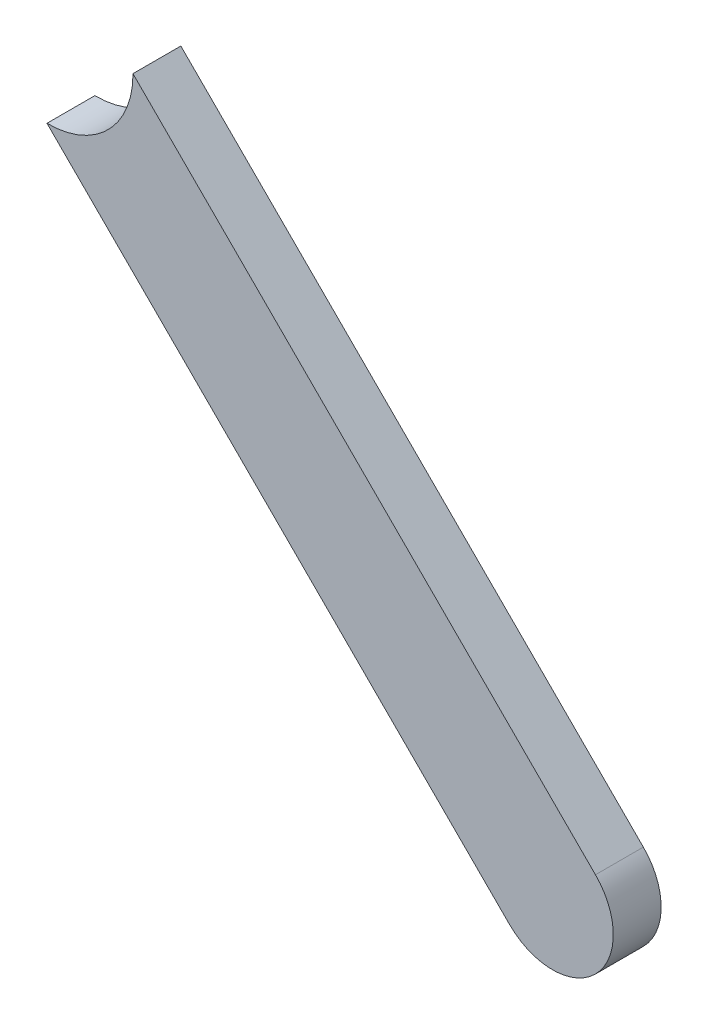
ISO-10303-21;
HEADER;
FILE_DESCRIPTION(('STEP AP214'),'2;1');
FILE_NAME('part.step','',(''),(''),'','','');
FILE_SCHEMA(('AUTOMOTIVE_DESIGN { 1 0 10303 214 1 1 1 1 }'));
ENDSEC;
DATA;
#1=APPLICATION_CONTEXT('core data for automotive mechanical design processes');
#2=APPLICATION_PROTOCOL_DEFINITION('international standard','automotive_design',2000,#1);
#3=PRODUCT_CONTEXT('',#1,'mechanical');
#4=PRODUCT('Part','Part','',(#3));
#5=PRODUCT_RELATED_PRODUCT_CATEGORY('part','',(#4));
#6=PRODUCT_DEFINITION_FORMATION('','',#4);
#7=PRODUCT_DEFINITION_CONTEXT('part definition',#1,'design');
#8=PRODUCT_DEFINITION('design','',#6,#7);
#9=PRODUCT_DEFINITION_SHAPE('','',#8);
#10=(LENGTH_UNIT() NAMED_UNIT(*) SI_UNIT(.MILLI.,.METRE.));
#11=(NAMED_UNIT(*) PLANE_ANGLE_UNIT() SI_UNIT($,.RADIAN.));
#12=(NAMED_UNIT(*) SI_UNIT($,.STERADIAN.) SOLID_ANGLE_UNIT());
#13=UNCERTAINTY_MEASURE_WITH_UNIT(LENGTH_MEASURE(1.E-05),#10,'distance_accuracy_value','');
#14=(GEOMETRIC_REPRESENTATION_CONTEXT(3) GLOBAL_UNCERTAINTY_ASSIGNED_CONTEXT((#13)) GLOBAL_UNIT_ASSIGNED_CONTEXT((#10,
#11,#12)) REPRESENTATION_CONTEXT('',''));
#15=CARTESIAN_POINT('',(0.,0.,0.));
#16=DIRECTION('',(0.,0.,1.));
#17=DIRECTION('',(1.,0.,0.));
#18=AXIS2_PLACEMENT_3D('',#15,#16,#17);
#19=CARTESIAN_POINT('',(136.140372153798,73.0504185062015,0.));
#20=DIRECTION('',(0.707106781186548,0.707106781186548,0.));
#21=DIRECTION('',(0.707106781186548,-0.707106781186548,0.));
#22=AXIS2_PLACEMENT_3D('',#19,#20,#21);
#23=PLANE('',#22);
#24=DIRECTION('',(0.707106781186548,-0.707106781186548,0.));
#25=VECTOR('',#24,1.);
#26=CARTESIAN_POINT('',(135.96439406,73.2263966,0.1999996));
#27=LINE('',#26,#25);
#28=CARTESIAN_POINT('',(136.140372153798,73.0504185062016,0.1999996));
#29=VERTEX_POINT('',#28);
#30=CARTESIAN_POINT('',(138.0725966,71.11819406,0.1999996));
#31=VERTEX_POINT('',#30);
#32=EDGE_CURVE('E11',#29,#31,#27,.T.);
#33=ORIENTED_EDGE('',*,*,#32,.F.);
#34=DIRECTION('',(0.,0.,1.));
#35=VECTOR('',#34,1.);
#36=CARTESIAN_POINT('',(136.140372153798,73.0504185062016,0.));
#37=LINE('',#36,#35);
#38=CARTESIAN_POINT('',(136.140372153798,73.0504185062016,0.));
#39=VERTEX_POINT('',#38);
#40=EDGE_CURVE('E24',#39,#29,#37,.T.);
#41=ORIENTED_EDGE('',*,*,#40,.F.);
#42=DIRECTION('',(0.707106781186548,-0.707106781186548,0.));
#43=VECTOR('',#42,1.);
#44=CARTESIAN_POINT('',(135.96439406,73.2263966,0.));
#45=LINE('',#44,#43);
#46=CARTESIAN_POINT('',(138.0725966,71.11819406,0.));
#47=VERTEX_POINT('',#46);
#48=EDGE_CURVE('E82',#39,#47,#45,.T.);
#49=ORIENTED_EDGE('',*,*,#48,.T.);
#50=DIRECTION('',(0.,0.,1.));
#51=VECTOR('',#50,1.);
#52=CARTESIAN_POINT('',(138.0725966,71.11819406,0.));
#53=LINE('',#52,#51);
#54=EDGE_CURVE('E37',#47,#31,#53,.T.);
#55=ORIENTED_EDGE('',*,*,#54,.T.);
#56=EDGE_LOOP('',(#33,#41,#49,#55));
#57=FACE_BOUND('',#56,.T.);
#58=ADVANCED_FACE('F17',(#57),#23,.F.);
#59=CARTESIAN_POINT('',(138.25220127,71.29779873,0.));
#60=DIRECTION('',(0.,0.,-1.));
#61=DIRECTION('',(-0.707106781186548,-0.707106781186548,0.));
#62=AXIS2_PLACEMENT_3D('',#59,#60,#61);
#63=CYLINDRICAL_SURFACE('',#62,0.253999360179549);
#64=CARTESIAN_POINT('',(138.25220127,71.29779873,0.1999996));
#65=DIRECTION('',(0.,0.,1.));
#66=DIRECTION('',(-0.707106781186548,-0.707106781186548,0.));
#67=AXIS2_PLACEMENT_3D('',#64,#65,#66);
#68=CIRCLE('',#67,0.253999360179549);
#69=CARTESIAN_POINT('',(138.43180594,71.4774034,0.1999996));
#70=VERTEX_POINT('',#69);
#71=EDGE_CURVE('E97',#31,#70,#68,.T.);
#72=ORIENTED_EDGE('',*,*,#71,.F.);
#73=ORIENTED_EDGE('',*,*,#54,.F.);
#74=CARTESIAN_POINT('',(138.25220127,71.29779873,0.));
#75=DIRECTION('',(0.,0.,1.));
#76=DIRECTION('',(-0.707106781186548,-0.707106781186548,0.));
#77=AXIS2_PLACEMENT_3D('',#74,#75,#76);
#78=CIRCLE('',#77,0.253999360179549);
#79=CARTESIAN_POINT('',(138.43180594,71.4774034,0.));
#80=VERTEX_POINT('',#79);
#81=EDGE_CURVE('E94',#47,#80,#78,.T.);
#82=ORIENTED_EDGE('',*,*,#81,.T.);
#83=DIRECTION('',(0.,0.,1.));
#84=VECTOR('',#83,1.);
#85=CARTESIAN_POINT('',(138.43180594,71.4774034,0.));
#86=LINE('',#85,#84);
#87=EDGE_CURVE('E92',#80,#70,#86,.T.);
#88=ORIENTED_EDGE('',*,*,#87,.T.);
#89=EDGE_LOOP('',(#72,#73,#82,#88));
#90=FACE_BOUND('',#89,.T.);
#91=ADVANCED_FACE('F103',(#90),#63,.T.);
#92=CARTESIAN_POINT('',(138.43180594,71.4774034,0.));
#93=DIRECTION('',(-0.707106781186548,-0.707106781186548,0.));
#94=DIRECTION('',(-0.707106781186548,0.707106781186548,0.));
#95=AXIS2_PLACEMENT_3D('',#92,#93,#94);
#96=PLANE('',#95);
#97=DIRECTION('',(-0.707106781186548,0.707106781186548,0.));
#98=VECTOR('',#97,1.);
#99=CARTESIAN_POINT('',(138.43180594,71.4774034,0.1999996));
#100=LINE('',#99,#98);
#101=CARTESIAN_POINT('',(136.499581493798,73.4096278462015,0.1999996));
#102=VERTEX_POINT('',#101);
#103=EDGE_CURVE('E89',#70,#102,#100,.T.);
#104=ORIENTED_EDGE('',*,*,#103,.F.);
#105=ORIENTED_EDGE('',*,*,#87,.F.);
#106=DIRECTION('',(-0.707106781186548,0.707106781186548,0.));
#107=VECTOR('',#106,1.);
#108=CARTESIAN_POINT('',(138.43180594,71.4774034,0.));
#109=LINE('',#108,#107);
#110=CARTESIAN_POINT('',(136.499581493798,73.4096278462015,0.));
#111=VERTEX_POINT('',#110);
#112=EDGE_CURVE('E87',#80,#111,#109,.T.);
#113=ORIENTED_EDGE('',*,*,#112,.T.);
#114=DIRECTION('',(0.,0.,1.));
#115=VECTOR('',#114,1.);
#116=CARTESIAN_POINT('',(136.499581493798,73.4096278462015,0.));
#117=LINE('',#116,#115);
#118=EDGE_CURVE('E69',#111,#102,#117,.T.);
#119=ORIENTED_EDGE('',*,*,#118,.T.);
#120=EDGE_LOOP('',(#104,#105,#113,#119));
#121=FACE_BOUND('',#120,.T.);
#122=ADVANCED_FACE('F108',(#121),#96,.F.);
#123=CARTESIAN_POINT('',(136.144,73.406,0.));
#124=DIRECTION('',(0.,0.,-1.));
#125=DIRECTION('',(1.,0.,0.));
#126=AXIS2_PLACEMENT_3D('',#123,#124,#125);
#127=CYLINDRICAL_SURFACE('',#126,0.3556);
#128=DIRECTION('',(0.,0.,1.));
#129=VECTOR('',#128,1.);
#130=CARTESIAN_POINT('',(136.4996,73.406,0.));
#131=LINE('',#130,#129);
#132=CARTESIAN_POINT('',(136.4996,73.406,0.));
#133=VERTEX_POINT('',#132);
#134=CARTESIAN_POINT('',(136.4996,73.406,0.1999996));
#135=VERTEX_POINT('',#134);
#136=EDGE_CURVE('E59',#133,#135,#131,.T.);
#137=ORIENTED_EDGE('',*,*,#136,.T.);
#138=CARTESIAN_POINT('',(136.144,73.406,0.1999996));
#139=DIRECTION('',(0.,0.,1.));
#140=DIRECTION('',(1.,0.,0.));
#141=AXIS2_PLACEMENT_3D('',#138,#139,#140);
#142=CIRCLE('',#141,0.3556);
#143=EDGE_CURVE('E70',#135,#102,#142,.T.);
#144=ORIENTED_EDGE('',*,*,#143,.T.);
#145=ORIENTED_EDGE('',*,*,#118,.F.);
#146=CARTESIAN_POINT('',(136.144,73.406,0.));
#147=DIRECTION('',(0.,0.,1.));
#148=DIRECTION('',(1.,0.,0.));
#149=AXIS2_PLACEMENT_3D('',#146,#147,#148);
#150=CIRCLE('',#149,0.3556);
#151=EDGE_CURVE('E73',#133,#111,#150,.T.);
#152=ORIENTED_EDGE('',*,*,#151,.F.);
#153=EDGE_LOOP('',(#137,#144,#145,#152));
#154=FACE_BOUND('',#153,.T.);
#155=ADVANCED_FACE('F74',(#154),#127,.F.);
#156=CARTESIAN_POINT('',(136.144,73.406,0.));
#157=DIRECTION('',(0.,0.,-1.));
#158=DIRECTION('',(1.,0.,0.));
#159=AXIS2_PLACEMENT_3D('',#156,#157,#158);
#160=CYLINDRICAL_SURFACE('',#159,0.3556);
#161=ORIENTED_EDGE('',*,*,#40,.T.);
#162=CARTESIAN_POINT('',(136.144,73.406,0.1999996));
#163=DIRECTION('',(0.,0.,1.));
#164=DIRECTION('',(1.,0.,0.));
#165=AXIS2_PLACEMENT_3D('',#162,#163,#164);
#166=CIRCLE('',#165,0.3556);
#167=EDGE_CURVE('E65',#29,#135,#166,.T.);
#168=ORIENTED_EDGE('',*,*,#167,.T.);
#169=ORIENTED_EDGE('',*,*,#136,.F.);
#170=EDGE_CURVE('E63',#39,#133,#150,.T.);
#171=ORIENTED_EDGE('',*,*,#170,.F.);
#172=EDGE_LOOP('',(#161,#168,#169,#171));
#173=FACE_BOUND('',#172,.T.);
#174=ADVANCED_FACE('F61',(#173),#160,.F.);
#175=CARTESIAN_POINT('',(135.96439406,73.2263966,0.));
#176=DIRECTION('',(0.,0.,-1.));
#177=DIRECTION('',(-1.,0.,0.));
#178=AXIS2_PLACEMENT_3D('',#175,#176,#177);
#179=PLANE('',#178);
#180=ORIENTED_EDGE('',*,*,#48,.F.);
#181=ORIENTED_EDGE('',*,*,#170,.T.);
#182=ORIENTED_EDGE('',*,*,#151,.T.);
#183=ORIENTED_EDGE('',*,*,#112,.F.);
#184=ORIENTED_EDGE('',*,*,#81,.F.);
#185=EDGE_LOOP('',(#180,#181,#182,#183,#184));
#186=FACE_BOUND('',#185,.T.);
#187=ADVANCED_FACE('F80',(#186),#179,.T.);
#188=CARTESIAN_POINT('',(135.96439406,73.2263966,0.1999996));
#189=DIRECTION('',(0.,0.,-1.));
#190=DIRECTION('',(-1.,0.,0.));
#191=AXIS2_PLACEMENT_3D('',#188,#189,#190);
#192=PLANE('',#191);
#193=ORIENTED_EDGE('',*,*,#167,.F.);
#194=ORIENTED_EDGE('',*,*,#32,.T.);
#195=ORIENTED_EDGE('',*,*,#71,.T.);
#196=ORIENTED_EDGE('',*,*,#103,.T.);
#197=ORIENTED_EDGE('',*,*,#143,.F.);
#198=EDGE_LOOP('',(#193,#194,#195,#196,#197));
#199=FACE_BOUND('',#198,.T.);
#200=ADVANCED_FACE('F106',(#199),#192,.F.);
#201=CLOSED_SHELL('',(#58,#91,#122,#155,#174,#187,#200));
#202=MANIFOLD_SOLID_BREP('B1',#201);
#203=ADVANCED_BREP_SHAPE_REPRESENTATION('',(#18,#202),#14);
#204=SHAPE_DEFINITION_REPRESENTATION(#9,#203);
ENDSEC;
END-ISO-10303-21;
